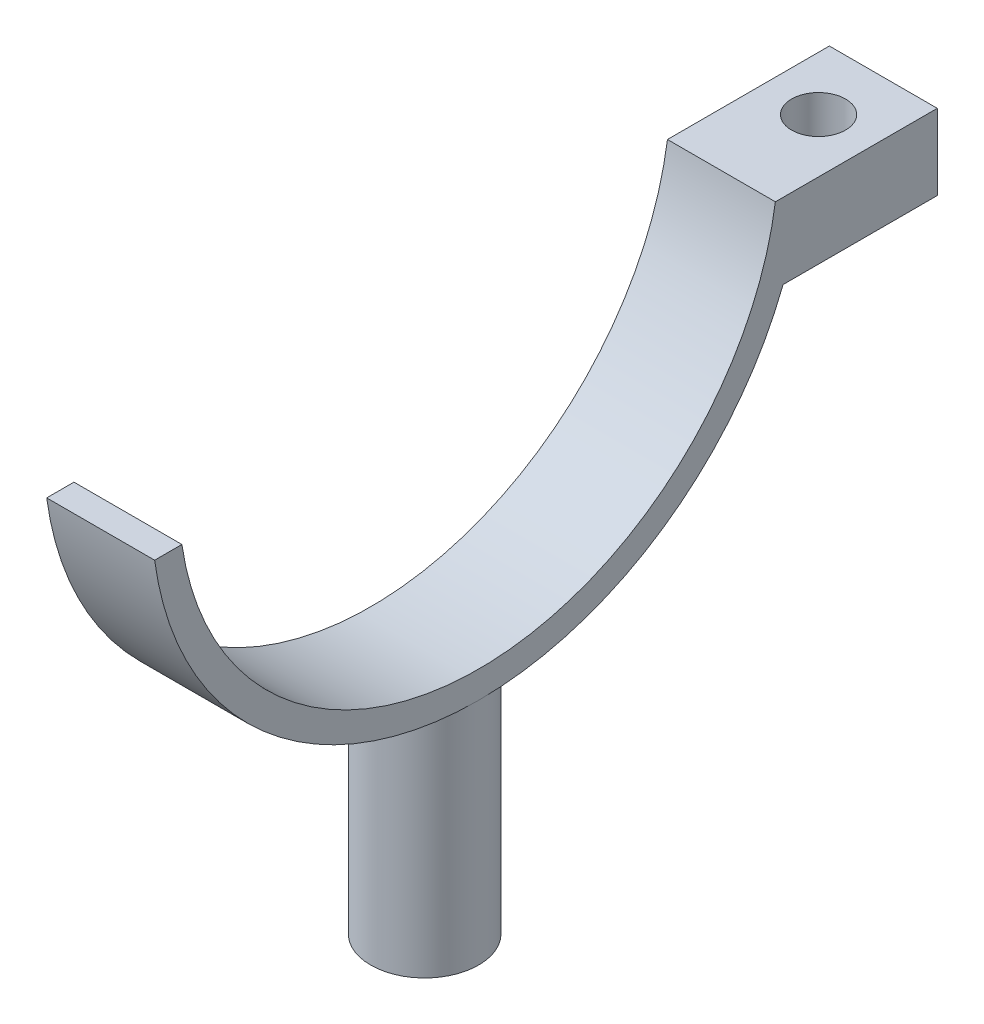
ISO-10303-21;
HEADER;
FILE_DESCRIPTION(('STEP AP214'),'2;1');
FILE_NAME('part.step','',(''),(''),'','','');
FILE_SCHEMA(('AUTOMOTIVE_DESIGN { 1 0 10303 214 1 1 1 1 }'));
ENDSEC;
DATA;
#1=APPLICATION_CONTEXT('core data for automotive mechanical design processes');
#2=APPLICATION_PROTOCOL_DEFINITION('international standard','automotive_design',2000,#1);
#3=PRODUCT_CONTEXT('',#1,'mechanical');
#4=PRODUCT('Part','Part','',(#3));
#5=PRODUCT_RELATED_PRODUCT_CATEGORY('part','',(#4));
#6=PRODUCT_DEFINITION_FORMATION('','',#4);
#7=PRODUCT_DEFINITION_CONTEXT('part definition',#1,'design');
#8=PRODUCT_DEFINITION('design','',#6,#7);
#9=PRODUCT_DEFINITION_SHAPE('','',#8);
#10=(LENGTH_UNIT() NAMED_UNIT(*) SI_UNIT(.MILLI.,.METRE.));
#11=(NAMED_UNIT(*) PLANE_ANGLE_UNIT() SI_UNIT($,.RADIAN.));
#12=(NAMED_UNIT(*) SI_UNIT($,.STERADIAN.) SOLID_ANGLE_UNIT());
#13=UNCERTAINTY_MEASURE_WITH_UNIT(LENGTH_MEASURE(1.E-05),#10,'distance_accuracy_value','');
#14=(GEOMETRIC_REPRESENTATION_CONTEXT(3) GLOBAL_UNCERTAINTY_ASSIGNED_CONTEXT((#13)) GLOBAL_UNIT_ASSIGNED_CONTEXT((#10,
#11,#12)) REPRESENTATION_CONTEXT('',''));
#15=CARTESIAN_POINT('',(0.,0.,0.));
#16=DIRECTION('',(0.,0.,1.));
#17=DIRECTION('',(1.,0.,0.));
#18=AXIS2_PLACEMENT_3D('',#15,#16,#17);
#19=CARTESIAN_POINT('',(0.,23.5,0.));
#20=DIRECTION('',(0.,-1.,0.));
#21=DIRECTION('',(0.,0.,-1.));
#22=AXIS2_PLACEMENT_3D('',#19,#20,#21);
#23=CYLINDRICAL_SURFACE('',#22,5.);
#24=CARTESIAN_POINT('',(0.,0.,0.));
#25=DIRECTION('',(0.,1.,0.));
#26=DIRECTION('',(0.,0.,1.));
#27=AXIS2_PLACEMENT_3D('',#24,#25,#26);
#28=CIRCLE('',#27,5.);
#29=CARTESIAN_POINT('',(0.,0.,5.));
#30=VERTEX_POINT('',#29);
#31=EDGE_CURVE('E179',#30,#30,#28,.T.);
#32=ORIENTED_EDGE('',*,*,#31,.T.);
#33=EDGE_LOOP('',(#32));
#34=FACE_BOUND('',#33,.T.);
#35=CARTESIAN_POINT('',(0.,21.6655610043104,-5.));
#36=CARTESIAN_POINT('',(-0.139443584153446,21.6655619667517,-5.00000212698932));
#37=CARTESIAN_POINT('',(-0.278858320102935,21.6645827122606,-4.99416481701411));
#38=CARTESIAN_POINT('',(-0.556728763199482,21.6606962767265,-4.97086374407249));
#39=CARTESIAN_POINT('',(-0.695184273582498,21.657788711312,-4.95339766313206));
#40=CARTESIAN_POINT('',(-0.970185358793091,21.6501266671217,-4.90695446040499));
#41=CARTESIAN_POINT('',(-1.10672965803471,21.6453710105895,-4.877969997887));
#42=CARTESIAN_POINT('',(-1.37690276637723,21.6341495045192,-4.80869970755319));
#43=CARTESIAN_POINT('',(-1.51053048557515,21.6276830271164,-4.76840973032844));
#44=CARTESIAN_POINT('',(-1.77371851222138,21.6132362761014,-4.67689114085769));
#45=CARTESIAN_POINT('',(-1.90328354182152,21.6052578421094,-4.62567581223044));
#46=CARTESIAN_POINT('',(-2.15766550580425,21.5880069670029,-4.51263326742396));
#47=CARTESIAN_POINT('',(-2.28248066935324,21.5787340491818,-4.4508021399327));
#48=CARTESIAN_POINT('',(-2.52639742820799,21.5591640128181,-4.3170192227186));
#49=CARTESIAN_POINT('',(-2.64550183059123,21.5488674052729,-4.24507247507632));
#50=CARTESIAN_POINT('',(-2.87730014032827,21.527530967965,-4.09151306055528));
#51=CARTESIAN_POINT('',(-2.98999164125424,21.5164908625553,-4.00989680015859));
#52=CARTESIAN_POINT('',(-3.20906272727284,21.4938847453543,-3.83686853732477));
#53=CARTESIAN_POINT('',(-3.31538222201007,21.4823151316843,-3.74538091660069));
#54=CARTESIAN_POINT('',(-3.51999380886452,21.4590572791706,-3.55377208353477));
#55=CARTESIAN_POINT('',(-3.61828291435501,21.4473689979934,-3.45364768724646));
#56=CARTESIAN_POINT('',(-3.80608475753882,21.4242090975448,-3.2455138031601));
#57=CARTESIAN_POINT('',(-3.895600187751,21.4127374126812,-3.13750675230291));
#58=CARTESIAN_POINT('',(-4.06529764384736,21.3903235069514,-2.91427858078361));
#59=CARTESIAN_POINT('',(-4.14547621662164,21.3793814828418,-2.79905481519271));
#60=CARTESIAN_POINT('',(-4.29630901028871,21.3582796822363,-2.56156667501755));
#61=CARTESIAN_POINT('',(-4.36690841598697,21.3481245396066,-2.43926705935329));
#62=CARTESIAN_POINT('',(-4.49756856342976,21.3289479467167,-2.18902073277526));
#63=CARTESIAN_POINT('',(-4.55762536928444,21.3199269202136,-2.06107193505681));
#64=CARTESIAN_POINT('',(-4.66669810280202,21.3032838769269,-1.80051536754455));
#65=CARTESIAN_POINT('',(-4.71571866042783,21.2956612737217,-1.6679095785586));
#66=CARTESIAN_POINT('',(-4.80239246641606,21.2820239468848,-1.39893906511972));
#67=CARTESIAN_POINT('',(-4.84004156158665,21.2760098108041,-1.26257298709471));
#68=CARTESIAN_POINT('',(-4.93482677384826,21.2607582338395,-0.851897428517523));
#69=CARTESIAN_POINT('',(-4.97491762134458,21.2541354639944,-0.573332150412891));
#70=CARTESIAN_POINT('',(-5.00784845110077,21.2487071979125,-0.013508141523446));
#71=CARTESIAN_POINT('',(-5.00069158700869,21.24990117993,0.26775040824198));
#72=CARTESIAN_POINT('',(-4.93972313779376,21.2599068910079,0.822278628990223));
#73=CARTESIAN_POINT('',(-4.88636562043913,21.2686444778315,1.09559937404348));
#74=CARTESIAN_POINT('',(-4.73520844678754,21.2926765968932,1.62934328047631));
#75=CARTESIAN_POINT('',(-4.63740745705753,21.307971325864,1.88976605461935));
#76=CARTESIAN_POINT('',(-4.39969128905291,21.3435246410986,2.39168788063959));
#77=CARTESIAN_POINT('',(-4.25958855860162,21.3638052572021,2.63309649250964));
#78=CARTESIAN_POINT('',(-3.94138207738454,21.4070767013207,3.08914787749604));
#79=CARTESIAN_POINT('',(-3.7632753077663,21.4300677445737,3.30378852215043));
#80=CARTESIAN_POINT('',(-3.37159660393306,21.4765254154872,3.70289497101461));
#81=CARTESIAN_POINT('',(-3.15762773972249,21.4999944465737,3.88697116801712));
#82=CARTESIAN_POINT('',(-2.70163706995053,21.5444980846082,4.21667096932669));
#83=CARTESIAN_POINT('',(-2.4596150150345,21.565532669914,4.36229423180184));
#84=CARTESIAN_POINT('',(-1.95394078419997,21.6027868408541,4.61102874691625));
#85=CARTESIAN_POINT('',(-1.69026545751547,21.6190011850515,4.71409376956023));
#86=CARTESIAN_POINT('',(-1.14901757460161,21.6446917002908,4.87436136493661));
#87=CARTESIAN_POINT('',(-0.871446219677511,21.6541684527215,4.93156789486562));
#88=CARTESIAN_POINT('',(-0.313769540393768,21.6651985235663,4.99794742363548));
#89=CARTESIAN_POINT('',(-0.033732039087039,21.6668434013599,5.00767550823161));
#90=CARTESIAN_POINT('',(0.523970353030568,21.6622672802038,4.98030058284549));
#91=CARTESIAN_POINT('',(0.801635333275737,21.6560465790827,4.94319934604698));
#92=CARTESIAN_POINT('',(1.34495184877935,21.6365247608226,4.8236919873343));
#93=CARTESIAN_POINT('',(1.61066712541625,21.6232677241618,4.74156781598827));
#94=CARTESIAN_POINT('',(2.12456332415962,21.5912039003825,4.53464118822863));
#95=CARTESIAN_POINT('',(2.37274321415325,21.5723967869293,4.40983622219293));
#96=CARTESIAN_POINT('',(2.84699596840396,21.5311388525307,4.11977860918067));
#97=CARTESIAN_POINT('',(3.07284827031319,21.5086565756182,3.95416989248123));
#98=CARTESIAN_POINT('',(3.49375564504005,21.4626738147836,3.58769413572803));
#99=CARTESIAN_POINT('',(3.68880859245762,21.4391732607347,3.38682466442024));
#100=CARTESIAN_POINT('',(4.04460439171338,21.3935124609906,2.95307530573774));
#101=CARTESIAN_POINT('',(4.20497729172226,21.3713683169698,2.71989003254675));
#102=CARTESIAN_POINT('',(4.48426937452705,21.3311734452444,2.22955361041084));
#103=CARTESIAN_POINT('',(4.60318987854038,21.3131225870804,1.97240322564009));
#104=CARTESIAN_POINT('',(4.79562892702519,21.2832162287159,1.4425940153422));
#105=CARTESIAN_POINT('',(4.8693419097951,21.2713342305092,1.17000719360469));
#106=CARTESIAN_POINT('',(4.96988245791764,21.2549996263515,0.615955813701631));
#107=CARTESIAN_POINT('',(4.99671380508158,21.2505464211417,0.334491973485424));
#108=CARTESIAN_POINT('',(5.00120443268276,21.2497992252846,-0.0861246486637549));
#109=CARTESIAN_POINT('',(4.9968618430929,21.25051903347,-0.225306877630175));
#110=CARTESIAN_POINT('',(4.97659677346279,21.2538568691175,-0.502788755491753));
#111=CARTESIAN_POINT('',(4.96067864152403,21.2564741838214,-0.641088716119968));
#112=CARTESIAN_POINT('',(4.91737127103666,21.2635383825253,-0.915873048172846));
#113=CARTESIAN_POINT('',(4.88997795314268,21.2679859171453,-1.05235675611287));
#114=CARTESIAN_POINT('',(4.82394287433151,21.2785835607357,-1.32245737609477));
#115=CARTESIAN_POINT('',(4.78530516831378,21.2847330559138,-1.4560753029641));
#116=CARTESIAN_POINT('',(4.69709777841788,21.2985598764469,-1.71946155936039));
#117=CARTESIAN_POINT('',(4.64753603466773,21.306236091713,-1.84923260766114));
#118=CARTESIAN_POINT('',(4.53784752920836,21.3229042662041,-2.10408609780574));
#119=CARTESIAN_POINT('',(4.47772455711332,21.3318957532861,-2.22917020196609));
#120=CARTESIAN_POINT('',(4.34730694128339,21.3509534395458,-2.47389465570432));
#121=CARTESIAN_POINT('',(4.27700833791091,21.3610200566866,-2.59353286219086));
#122=CARTESIAN_POINT('',(4.12677778786866,21.3819458036252,-2.82646517786897));
#123=CARTESIAN_POINT('',(4.04684923362647,21.3928046538076,-2.93976150069169));
#124=CARTESIAN_POINT('',(3.87690647260989,21.4151508543282,-3.16057439925423));
#125=CARTESIAN_POINT('',(3.78678583702487,21.4266440428095,-3.26800849015004));
#126=CARTESIAN_POINT('',(3.59788862067183,21.4498161706791,-3.47488281522564));
#127=CARTESIAN_POINT('',(3.49911514447835,21.4614950422246,-3.57432589216764));
#128=CARTESIAN_POINT('',(3.29350056420809,21.484722900797,-3.76463669397941));
#129=CARTESIAN_POINT('',(3.18665465837078,21.4962718057477,-3.85549924140174));
#130=CARTESIAN_POINT('',(2.96571947314661,21.5189035314867,-4.0279195948868));
#131=CARTESIAN_POINT('',(2.85163287947299,21.5299865225851,-4.10948081995835));
#132=CARTESIAN_POINT('',(2.61610131153583,21.5514557058962,-4.26332539155645));
#133=CARTESIAN_POINT('',(2.49460860012218,21.5618362056756,-4.33553647799624));
#134=CARTESIAN_POINT('',(2.24592522318723,21.5815065231772,-4.46942457086502));
#135=CARTESIAN_POINT('',(2.11873667571615,21.5907967417535,-4.53110545265855));
#136=CARTESIAN_POINT('',(1.85960295510975,21.608013577185,-4.64346885882446));
#137=CARTESIAN_POINT('',(1.72766118916386,21.6159411481769,-4.69415908549596));
#138=CARTESIAN_POINT('',(1.4599263747943,21.6302059634041,-4.78419971332449));
#139=CARTESIAN_POINT('',(1.32413416485404,21.6365435509631,-4.8235525628235));
#140=CARTESIAN_POINT('',(0.992978410023558,21.6496883134775,-4.90446714287368));
#141=CARTESIAN_POINT('',(0.796137778483661,21.6556117027478,-4.94024955996811));
#142=CARTESIAN_POINT('',(0.399511669277937,21.6635473245055,-4.98801425593394));
#143=CARTESIAN_POINT('',(0.199726243479829,21.6655596257975,-4.99999695349492));
#144=CARTESIAN_POINT('',(0.,21.6655610043104,-5.));
#145=B_SPLINE_CURVE_WITH_KNOTS('',3,(#35,#36,#37,#38,#39,#40,#41,#42,#43,#44,#45,#46,#47,#48,
#49,#50,#51,#52,#53,#54,#55,#56,#57,#58,#59,#60,#61,#62,#63,#64,#65,#66,#67,#68,#69,#70,#71,#72,
#73,#74,#75,#76,#77,#78,#79,#80,#81,#82,#83,#84,#85,#86,#87,#88,#89,#90,#91,#92,#93,#94,#95,#96,
#97,#98,#99,#100,#101,#102,#103,#104,#105,#106,#107,#108,#109,#110,#111,#112,#113,#114,#115,
#116,#117,#118,#119,#120,#121,#122,#123,#124,#125,#126,#127,#128,#129,#130,#131,#132,#133,#134,
#135,#136,#137,#138,#139,#140,#141,#142,#143,#144),.UNSPECIFIED.,.T.,.F.,(4,2,2,2,2,2,2,2,2,2,2,
2,2,2,2,2,2,2,2,2,2,2,2,2,2,2,2,2,2,2,2,2,2,2,2,2,2,2,2,2,2,2,2,2,2,2,2,2,2,2,2,2,2,2,4),(0.,
0.418155610714612,0.836394597750961,1.25490055947855,1.67356032480793,2.09171393359548,
2.51002193989045,2.92812217698516,3.34637828456142,3.76810275532621,4.18998336469008,
4.6117340967023,5.03364031542278,5.45786725582155,5.88225223843601,6.30645884852915,
6.73082020449891,7.57093344863169,8.41099061820303,9.24288408889104,10.0748025204438,
10.9104649642048,11.7461938135754,12.5918709472374,13.4375555983933,14.2841564950592,
15.1306843294253,15.9672910285665,16.8038660506974,17.6352609961596,18.4667048358844,
19.3056784688101,20.1447099723008,20.9922929253446,21.8398488607996,22.6837333998155,
23.5275498618666,23.9448985788932,24.3620906088483,24.7794310735712,25.1966212249931,
25.6135091362311,26.0302477628305,26.4471489928319,26.863903784444,27.2855025752325,
27.7069507142575,28.1286515494453,28.5501968714665,28.9748269298392,29.3993003758336,
29.8234753805415,30.2475587145522,30.8464971247062,31.4454249981187),.UNSPECIFIED.);
#146=CARTESIAN_POINT('',(-5.,21.25,0.));
#147=VERTEX_POINT('',#146);
#148=CARTESIAN_POINT('',(5.,21.25,0.));
#149=VERTEX_POINT('',#148);
#150=EDGE_CURVE('E11',#147,#149,#145,.T.);
#151=ORIENTED_EDGE('',*,*,#150,.F.);
#152=EDGE_CURVE('E49',#149,#147,#145,.T.);
#153=ORIENTED_EDGE('',*,*,#152,.F.);
#154=EDGE_LOOP('',(#151,#153));
#155=FACE_BOUND('',#154,.T.);
#156=ADVANCED_FACE('F45',(#34,#155),#23,.T.);
#157=CARTESIAN_POINT('',(0.,0.,0.));
#158=DIRECTION('',(0.,1.,0.));
#159=DIRECTION('',(0.,0.,1.));
#160=AXIS2_PLACEMENT_3D('',#157,#158,#159);
#161=PLANE('',#160);
#162=ORIENTED_EDGE('',*,*,#31,.F.);
#163=EDGE_LOOP('',(#162));
#164=FACE_BOUND('',#163,.T.);
#165=ADVANCED_FACE('F234',(#164),#161,.F.);
#166=CARTESIAN_POINT('',(5.,51.5376,0.));
#167=DIRECTION('',(-1.,0.,0.));
#168=DIRECTION('',(0.,0.,1.));
#169=AXIS2_PLACEMENT_3D('',#166,#167,#168);
#170=CYLINDRICAL_SURFACE('',#169,30.2876);
#171=CARTESIAN_POINT('',(-5.,51.5376,0.));
#172=DIRECTION('',(1.,0.,0.));
#173=DIRECTION('',(0.,0.,-1.));
#174=AXIS2_PLACEMENT_3D('',#171,#172,#173);
#175=CIRCLE('',#174,30.2876);
#176=CARTESIAN_POINT('',(-5.,47.5,30.0172700291016));
#177=VERTEX_POINT('',#176);
#178=EDGE_CURVE('E156',#177,#147,#175,.T.);
#179=ORIENTED_EDGE('',*,*,#178,.T.);
#180=ORIENTED_EDGE('',*,*,#150,.T.);
#181=CARTESIAN_POINT('',(5.,51.5376,0.));
#182=DIRECTION('',(1.,0.,0.));
#183=DIRECTION('',(0.,0.,-1.));
#184=AXIS2_PLACEMENT_3D('',#181,#182,#183);
#185=CIRCLE('',#184,30.2876);
#186=CARTESIAN_POINT('',(5.,47.5,30.0172700291016));
#187=VERTEX_POINT('',#186);
#188=EDGE_CURVE('E143',#187,#149,#185,.T.);
#189=ORIENTED_EDGE('',*,*,#188,.F.);
#190=DIRECTION('',(-1.,0.,0.));
#191=VECTOR('',#190,1.);
#192=CARTESIAN_POINT('',(5.,47.5,30.0172700291016));
#193=LINE('',#192,#191);
#194=EDGE_CURVE('E155',#187,#177,#193,.T.);
#195=ORIENTED_EDGE('',*,*,#194,.T.);
#196=EDGE_LOOP('',(#179,#180,#189,#195));
#197=FACE_BOUND('',#196,.T.);
#198=ADVANCED_FACE('F196',(#197),#170,.T.);
#199=CARTESIAN_POINT('',(-5.,40.5,-28.2047886005196));
#200=VERTEX_POINT('',#199);
#201=EDGE_CURVE('E142',#147,#200,#175,.T.);
#202=ORIENTED_EDGE('',*,*,#201,.T.);
#203=DIRECTION('',(-1.,0.,0.));
#204=VECTOR('',#203,1.);
#205=CARTESIAN_POINT('',(5.,40.5,-28.2047886005196));
#206=LINE('',#205,#204);
#207=CARTESIAN_POINT('',(5.,40.5,-28.2047886005196));
#208=VERTEX_POINT('',#207);
#209=EDGE_CURVE('E138',#200,#208,#206,.F.);
#210=ORIENTED_EDGE('',*,*,#209,.T.);
#211=EDGE_CURVE('E110',#149,#208,#185,.T.);
#212=ORIENTED_EDGE('',*,*,#211,.F.);
#213=ORIENTED_EDGE('',*,*,#152,.T.);
#214=EDGE_LOOP('',(#202,#210,#212,#213));
#215=FACE_BOUND('',#214,.T.);
#216=ADVANCED_FACE('F188',(#215),#170,.T.);
#217=CARTESIAN_POINT('',(5.,47.5,-27.4926990308336));
#218=DIRECTION('',(0.,-1.,0.));
#219=DIRECTION('',(0.,0.,-1.));
#220=AXIS2_PLACEMENT_3D('',#217,#218,#219);
#221=PLANE('',#220);
#222=DIRECTION('',(0.,0.,1.));
#223=VECTOR('',#222,1.);
#224=CARTESIAN_POINT('',(-5.,47.5,-27.4926990308336));
#225=LINE('',#224,#223);
#226=CARTESIAN_POINT('',(-5.,47.5,-42.4926990308336));
#227=VERTEX_POINT('',#226);
#228=CARTESIAN_POINT('',(-5.,47.5,-27.4926990308336));
#229=VERTEX_POINT('',#228);
#230=EDGE_CURVE('E160',#227,#229,#225,.T.);
#231=ORIENTED_EDGE('',*,*,#230,.T.);
#232=DIRECTION('',(-1.,0.,0.));
#233=VECTOR('',#232,1.);
#234=CARTESIAN_POINT('',(5.,47.5,-27.4926990308336));
#235=LINE('',#234,#233);
#236=CARTESIAN_POINT('',(5.,47.5,-27.4926990308336));
#237=VERTEX_POINT('',#236);
#238=EDGE_CURVE('E176',#237,#229,#235,.T.);
#239=ORIENTED_EDGE('',*,*,#238,.F.);
#240=DIRECTION('',(0.,0.,1.));
#241=VECTOR('',#240,1.);
#242=CARTESIAN_POINT('',(5.,47.5,-27.4926990308336));
#243=LINE('',#242,#241);
#244=CARTESIAN_POINT('',(5.,47.5,-42.4926990308336));
#245=VERTEX_POINT('',#244);
#246=EDGE_CURVE('E146',#245,#237,#243,.T.);
#247=ORIENTED_EDGE('',*,*,#246,.F.);
#248=DIRECTION('',(-1.,0.,0.));
#249=VECTOR('',#248,1.);
#250=CARTESIAN_POINT('',(-5.,47.5,-42.4926990308336));
#251=LINE('',#250,#249);
#252=EDGE_CURVE('E123',#245,#227,#251,.T.);
#253=ORIENTED_EDGE('',*,*,#252,.T.);
#254=EDGE_LOOP('',(#231,#239,#247,#253));
#255=FACE_BOUND('',#254,.T.);
#256=CARTESIAN_POINT('',(0.,47.5,-36.4926990308336));
#257=DIRECTION('',(0.,1.,0.));
#258=DIRECTION('',(0.,0.,1.));
#259=AXIS2_PLACEMENT_3D('',#256,#257,#258);
#260=CIRCLE('',#259,2.5);
#261=CARTESIAN_POINT('',(0.,47.5,-33.9926990308336));
#262=VERTEX_POINT('',#261);
#263=EDGE_CURVE('E214',#262,#262,#260,.T.);
#264=ORIENTED_EDGE('',*,*,#263,.F.);
#265=EDGE_LOOP('',(#264));
#266=FACE_BOUND('',#265,.T.);
#267=ADVANCED_FACE('F208',(#255,#266),#221,.F.);
#268=CARTESIAN_POINT('',(5.,51.5376,0.));
#269=DIRECTION('',(-1.,0.,0.));
#270=DIRECTION('',(0.,0.,1.));
#271=AXIS2_PLACEMENT_3D('',#268,#269,#270);
#272=CYLINDRICAL_SURFACE('',#271,27.7876);
#273=CARTESIAN_POINT('',(-5.,51.5376,0.));
#274=DIRECTION('',(-1.,0.,0.));
#275=DIRECTION('',(0.,0.,-1.));
#276=AXIS2_PLACEMENT_3D('',#273,#274,#275);
#277=CIRCLE('',#276,27.7876);
#278=CARTESIAN_POINT('',(-5.,47.5,27.4926990308336));
#279=VERTEX_POINT('',#278);
#280=EDGE_CURVE('E163',#229,#279,#277,.T.);
#281=ORIENTED_EDGE('',*,*,#280,.T.);
#282=DIRECTION('',(-1.,0.,0.));
#283=VECTOR('',#282,1.);
#284=CARTESIAN_POINT('',(5.,47.5,27.4926990308336));
#285=LINE('',#284,#283);
#286=CARTESIAN_POINT('',(5.,47.5,27.4926990308336));
#287=VERTEX_POINT('',#286);
#288=EDGE_CURVE('E172',#287,#279,#285,.T.);
#289=ORIENTED_EDGE('',*,*,#288,.F.);
#290=CARTESIAN_POINT('',(5.,51.5376,0.));
#291=DIRECTION('',(-1.,0.,0.));
#292=DIRECTION('',(0.,0.,-1.));
#293=AXIS2_PLACEMENT_3D('',#290,#291,#292);
#294=CIRCLE('',#293,27.7876);
#295=EDGE_CURVE('E149',#237,#287,#294,.T.);
#296=ORIENTED_EDGE('',*,*,#295,.F.);
#297=ORIENTED_EDGE('',*,*,#238,.T.);
#298=EDGE_LOOP('',(#281,#289,#296,#297));
#299=FACE_BOUND('',#298,.T.);
#300=ADVANCED_FACE('F204',(#299),#272,.F.);
#301=CARTESIAN_POINT('',(5.,47.5,30.0172700291016));
#302=DIRECTION('',(0.,-1.,0.));
#303=DIRECTION('',(0.,0.,-1.));
#304=AXIS2_PLACEMENT_3D('',#301,#302,#303);
#305=PLANE('',#304);
#306=DIRECTION('',(0.,0.,1.));
#307=VECTOR('',#306,1.);
#308=CARTESIAN_POINT('',(-5.,47.5,30.0172700291016));
#309=LINE('',#308,#307);
#310=EDGE_CURVE('E166',#279,#177,#309,.T.);
#311=ORIENTED_EDGE('',*,*,#310,.T.);
#312=ORIENTED_EDGE('',*,*,#194,.F.);
#313=DIRECTION('',(0.,0.,1.));
#314=VECTOR('',#313,1.);
#315=CARTESIAN_POINT('',(5.,47.5,30.0172700291016));
#316=LINE('',#315,#314);
#317=EDGE_CURVE('E152',#287,#187,#316,.T.);
#318=ORIENTED_EDGE('',*,*,#317,.F.);
#319=ORIENTED_EDGE('',*,*,#288,.T.);
#320=EDGE_LOOP('',(#311,#312,#318,#319));
#321=FACE_BOUND('',#320,.T.);
#322=ADVANCED_FACE('F201',(#321),#305,.F.);
#323=CARTESIAN_POINT('',(5.,51.5376,0.));
#324=DIRECTION('',(1.,0.,0.));
#325=DIRECTION('',(0.,0.,-1.));
#326=AXIS2_PLACEMENT_3D('',#323,#324,#325);
#327=PLANE('',#326);
#328=ORIENTED_EDGE('',*,*,#246,.T.);
#329=ORIENTED_EDGE('',*,*,#295,.T.);
#330=ORIENTED_EDGE('',*,*,#317,.T.);
#331=ORIENTED_EDGE('',*,*,#188,.T.);
#332=ORIENTED_EDGE('',*,*,#211,.T.);
#333=DIRECTION('',(0.,0.,-1.));
#334=VECTOR('',#333,1.);
#335=CARTESIAN_POINT('',(5.,40.5,-27.4926990308336));
#336=LINE('',#335,#334);
#337=CARTESIAN_POINT('',(5.,40.5,-42.4926990308336));
#338=VERTEX_POINT('',#337);
#339=EDGE_CURVE('E103',#208,#338,#336,.T.);
#340=ORIENTED_EDGE('',*,*,#339,.T.);
#341=DIRECTION('',(0.,1.,0.));
#342=VECTOR('',#341,1.);
#343=CARTESIAN_POINT('',(5.,40.5,-42.4926990308336));
#344=LINE('',#343,#342);
#345=EDGE_CURVE('E106',#338,#245,#344,.T.);
#346=ORIENTED_EDGE('',*,*,#345,.T.);
#347=EDGE_LOOP('',(#328,#329,#330,#331,#332,#340,#346));
#348=FACE_BOUND('',#347,.T.);
#349=ADVANCED_FACE('F105',(#348),#327,.T.);
#350=CARTESIAN_POINT('',(-5.,51.5376,0.));
#351=DIRECTION('',(1.,0.,0.));
#352=DIRECTION('',(0.,0.,-1.));
#353=AXIS2_PLACEMENT_3D('',#350,#351,#352);
#354=PLANE('',#353);
#355=ORIENTED_EDGE('',*,*,#280,.F.);
#356=ORIENTED_EDGE('',*,*,#230,.F.);
#357=DIRECTION('',(0.,1.,0.));
#358=VECTOR('',#357,1.);
#359=CARTESIAN_POINT('',(-5.,40.5,-42.4926990308336));
#360=LINE('',#359,#358);
#361=CARTESIAN_POINT('',(-5.,40.5,-42.4926990308336));
#362=VERTEX_POINT('',#361);
#363=EDGE_CURVE('E125',#362,#227,#360,.T.);
#364=ORIENTED_EDGE('',*,*,#363,.F.);
#365=DIRECTION('',(0.,0.,1.));
#366=VECTOR('',#365,1.);
#367=CARTESIAN_POINT('',(-5.,40.5,-27.4926990308336));
#368=LINE('',#367,#366);
#369=EDGE_CURVE('E116',#362,#200,#368,.T.);
#370=ORIENTED_EDGE('',*,*,#369,.T.);
#371=ORIENTED_EDGE('',*,*,#201,.F.);
#372=ORIENTED_EDGE('',*,*,#178,.F.);
#373=ORIENTED_EDGE('',*,*,#310,.F.);
#374=EDGE_LOOP('',(#355,#356,#364,#370,#371,#372,#373));
#375=FACE_BOUND('',#374,.T.);
#376=ADVANCED_FACE('F192',(#375),#354,.F.);
#377=CARTESIAN_POINT('',(0.,40.5,0.));
#378=DIRECTION('',(0.,-1.,0.));
#379=DIRECTION('',(0.,0.,-1.));
#380=AXIS2_PLACEMENT_3D('',#377,#378,#379);
#381=PLANE('',#380);
#382=CARTESIAN_POINT('',(0.,40.5,-36.4926990308336));
#383=DIRECTION('',(0.,1.,0.));
#384=DIRECTION('',(0.,0.,1.));
#385=AXIS2_PLACEMENT_3D('',#382,#383,#384);
#386=CIRCLE('',#385,2.5);
#387=CARTESIAN_POINT('',(0.,40.5,-33.9926990308336));
#388=VERTEX_POINT('',#387);
#389=EDGE_CURVE('E136',#388,#388,#386,.T.);
#390=ORIENTED_EDGE('',*,*,#389,.T.);
#391=EDGE_LOOP('',(#390));
#392=FACE_BOUND('',#391,.T.);
#393=ORIENTED_EDGE('',*,*,#209,.F.);
#394=ORIENTED_EDGE('',*,*,#369,.F.);
#395=DIRECTION('',(-1.,0.,0.));
#396=VECTOR('',#395,1.);
#397=CARTESIAN_POINT('',(-5.,40.5,-42.4926990308336));
#398=LINE('',#397,#396);
#399=EDGE_CURVE('E115',#338,#362,#398,.T.);
#400=ORIENTED_EDGE('',*,*,#399,.F.);
#401=ORIENTED_EDGE('',*,*,#339,.F.);
#402=EDGE_LOOP('',(#393,#394,#400,#401));
#403=FACE_BOUND('',#402,.T.);
#404=ADVANCED_FACE('F128',(#392,#403),#381,.T.);
#405=CARTESIAN_POINT('',(-5.,40.5,-42.4926990308336));
#406=DIRECTION('',(0.,0.,-1.));
#407=DIRECTION('',(-1.,0.,0.));
#408=AXIS2_PLACEMENT_3D('',#405,#406,#407);
#409=PLANE('',#408);
#410=ORIENTED_EDGE('',*,*,#252,.F.);
#411=ORIENTED_EDGE('',*,*,#345,.F.);
#412=ORIENTED_EDGE('',*,*,#399,.T.);
#413=ORIENTED_EDGE('',*,*,#363,.T.);
#414=EDGE_LOOP('',(#410,#411,#412,#413));
#415=FACE_BOUND('',#414,.T.);
#416=ADVANCED_FACE('F120',(#415),#409,.T.);
#417=CARTESIAN_POINT('',(0.,40.5,-36.4926990308336));
#418=DIRECTION('',(0.,1.,0.));
#419=DIRECTION('',(0.,0.,1.));
#420=AXIS2_PLACEMENT_3D('',#417,#418,#419);
#421=CYLINDRICAL_SURFACE('',#420,2.5);
#422=CARTESIAN_POINT('',(0.,40.5,-33.9926990308336));
#423=CARTESIAN_POINT('',(0.,40.5729166666667,-33.9926990308336));
#424=CARTESIAN_POINT('',(0.,40.6458333333333,-33.9926990308336));
#425=CARTESIAN_POINT('',(0.,40.7916666666667,-33.9926990308336));
#426=CARTESIAN_POINT('',(0.,40.8645833333333,-33.9926990308336));
#427=CARTESIAN_POINT('',(0.,41.0104166666667,-33.9926990308336));
#428=CARTESIAN_POINT('',(0.,41.0833333333333,-33.9926990308336));
#429=CARTESIAN_POINT('',(0.,41.2291666666667,-33.9926990308336));
#430=CARTESIAN_POINT('',(0.,41.3020833333333,-33.9926990308336));
#431=CARTESIAN_POINT('',(0.,41.4479166666667,-33.9926990308336));
#432=CARTESIAN_POINT('',(0.,41.5208333333333,-33.9926990308336));
#433=CARTESIAN_POINT('',(0.,41.6666666666667,-33.9926990308336));
#434=CARTESIAN_POINT('',(0.,41.7395833333333,-33.9926990308336));
#435=CARTESIAN_POINT('',(0.,41.8854166666667,-33.9926990308336));
#436=CARTESIAN_POINT('',(0.,41.9583333333333,-33.9926990308336));
#437=CARTESIAN_POINT('',(0.,42.1041666666667,-33.9926990308336));
#438=CARTESIAN_POINT('',(0.,42.1770833333333,-33.9926990308336));
#439=CARTESIAN_POINT('',(0.,42.3229166666667,-33.9926990308336));
#440=CARTESIAN_POINT('',(0.,42.3958333333333,-33.9926990308336));
#441=CARTESIAN_POINT('',(0.,42.5416666666667,-33.9926990308336));
#442=CARTESIAN_POINT('',(0.,42.6145833333333,-33.9926990308336));
#443=CARTESIAN_POINT('',(0.,42.7604166666667,-33.9926990308336));
#444=CARTESIAN_POINT('',(0.,42.8333333333333,-33.9926990308336));
#445=CARTESIAN_POINT('',(0.,42.9791666666667,-33.9926990308336));
#446=CARTESIAN_POINT('',(0.,43.0520833333333,-33.9926990308336));
#447=CARTESIAN_POINT('',(0.,43.1979166666667,-33.9926990308336));
#448=CARTESIAN_POINT('',(0.,43.2708333333333,-33.9926990308336));
#449=CARTESIAN_POINT('',(0.,43.4166666666667,-33.9926990308336));
#450=CARTESIAN_POINT('',(0.,43.4895833333333,-33.9926990308336));
#451=CARTESIAN_POINT('',(0.,43.6354166666667,-33.9926990308336));
#452=CARTESIAN_POINT('',(0.,43.7083333333333,-33.9926990308336));
#453=CARTESIAN_POINT('',(0.,43.8541666666667,-33.9926990308336));
#454=CARTESIAN_POINT('',(0.,43.9270833333333,-33.9926990308336));
#455=CARTESIAN_POINT('',(0.,44.0729166666667,-33.9926990308336));
#456=CARTESIAN_POINT('',(0.,44.1458333333333,-33.9926990308336));
#457=CARTESIAN_POINT('',(0.,44.2916666666667,-33.9926990308336));
#458=CARTESIAN_POINT('',(0.,44.3645833333333,-33.9926990308336));
#459=CARTESIAN_POINT('',(0.,44.5104166666667,-33.9926990308336));
#460=CARTESIAN_POINT('',(0.,44.5833333333333,-33.9926990308336));
#461=CARTESIAN_POINT('',(0.,44.7291666666667,-33.9926990308336));
#462=CARTESIAN_POINT('',(0.,44.8020833333333,-33.9926990308336));
#463=CARTESIAN_POINT('',(0.,44.9479166666667,-33.9926990308336));
#464=CARTESIAN_POINT('',(0.,45.0208333333333,-33.9926990308336));
#465=CARTESIAN_POINT('',(0.,45.1666666666667,-33.9926990308336));
#466=CARTESIAN_POINT('',(0.,45.2395833333333,-33.9926990308336));
#467=CARTESIAN_POINT('',(0.,45.3854166666667,-33.9926990308336));
#468=CARTESIAN_POINT('',(0.,45.4583333333333,-33.9926990308336));
#469=CARTESIAN_POINT('',(0.,45.6041666666667,-33.9926990308336));
#470=CARTESIAN_POINT('',(0.,45.6770833333333,-33.9926990308336));
#471=CARTESIAN_POINT('',(0.,45.8229166666667,-33.9926990308336));
#472=CARTESIAN_POINT('',(0.,45.8958333333333,-33.9926990308336));
#473=CARTESIAN_POINT('',(0.,46.0416666666667,-33.9926990308336));
#474=CARTESIAN_POINT('',(0.,46.1145833333333,-33.9926990308336));
#475=CARTESIAN_POINT('',(0.,46.2604166666667,-33.9926990308336));
#476=CARTESIAN_POINT('',(0.,46.3333333333333,-33.9926990308336));
#477=CARTESIAN_POINT('',(0.,46.4791666666667,-33.9926990308336));
#478=CARTESIAN_POINT('',(0.,46.5520833333333,-33.9926990308336));
#479=CARTESIAN_POINT('',(0.,46.6979166666667,-33.9926990308336));
#480=CARTESIAN_POINT('',(0.,46.7708333333333,-33.9926990308336));
#481=CARTESIAN_POINT('',(0.,46.9166666666667,-33.9926990308336));
#482=CARTESIAN_POINT('',(0.,46.9895833333333,-33.9926990308336));
#483=CARTESIAN_POINT('',(0.,47.1354166666667,-33.9926990308336));
#484=CARTESIAN_POINT('',(0.,47.2083333333333,-33.9926990308336));
#485=CARTESIAN_POINT('',(0.,47.3541666666667,-33.9926990308336));
#486=CARTESIAN_POINT('',(0.,47.4270833333333,-33.9926990308336));
#487=CARTESIAN_POINT('',(0.,47.5,-33.9926990308336));
#488=B_SPLINE_CURVE_WITH_KNOTS('',3,(#422,#423,#424,#425,#426,#427,#428,#429,#430,#431,#432,
#433,#434,#435,#436,#437,#438,#439,#440,#441,#442,#443,#444,#445,#446,#447,#448,#449,#450,#451,
#452,#453,#454,#455,#456,#457,#458,#459,#460,#461,#462,#463,#464,#465,#466,#467,#468,#469,#470,
#471,#472,#473,#474,#475,#476,#477,#478,#479,#480,#481,#482,#483,#484,#485,#486,#487),
.UNSPECIFIED.,.F.,.F.,(4,2,2,2,2,2,2,2,2,2,2,2,2,2,2,2,2,2,2,2,2,2,2,2,2,2,2,2,2,2,2,2,4),(0.,
0.218750000000004,0.4375,0.656250000000004,0.875000000000001,1.09375,1.3125,1.53125,1.75,
1.96875000000001,2.1875,2.40625000000001,2.625,2.84375000000001,3.0625,3.28125000000001,3.5,
3.71875000000001,3.9375,4.15625,4.375,4.59375,4.8125,5.03125,5.25,5.46875,5.68750000000001,
5.90625,6.12500000000001,6.34375,6.56250000000001,6.78125,7.00000000000001),.UNSPECIFIED.);
#489=EDGE_CURVE('BSEAM225',#388,#262,#488,.T.);
#490=ORIENTED_EDGE('',*,*,#389,.F.);
#491=ORIENTED_EDGE('',*,*,#263,.T.);
#492=ORIENTED_EDGE('',*,*,#489,.T.);
#493=ORIENTED_EDGE('',*,*,#489,.F.);
#494=EDGE_LOOP('',(#490,#492,#491,#493));
#495=FACE_BOUND('',#494,.T.);
#496=ADVANCED_FACE('F225',(#495),#421,.F.);
#497=CLOSED_SHELL('',(#156,#165,#198,#216,#267,#300,#322,#349,#376,#404,#416,#496));
#498=MANIFOLD_SOLID_BREP('B2',#497);
#499=ADVANCED_BREP_SHAPE_REPRESENTATION('',(#18,#498),#14);
#500=SHAPE_DEFINITION_REPRESENTATION(#9,#499);
ENDSEC;
END-ISO-10303-21;
